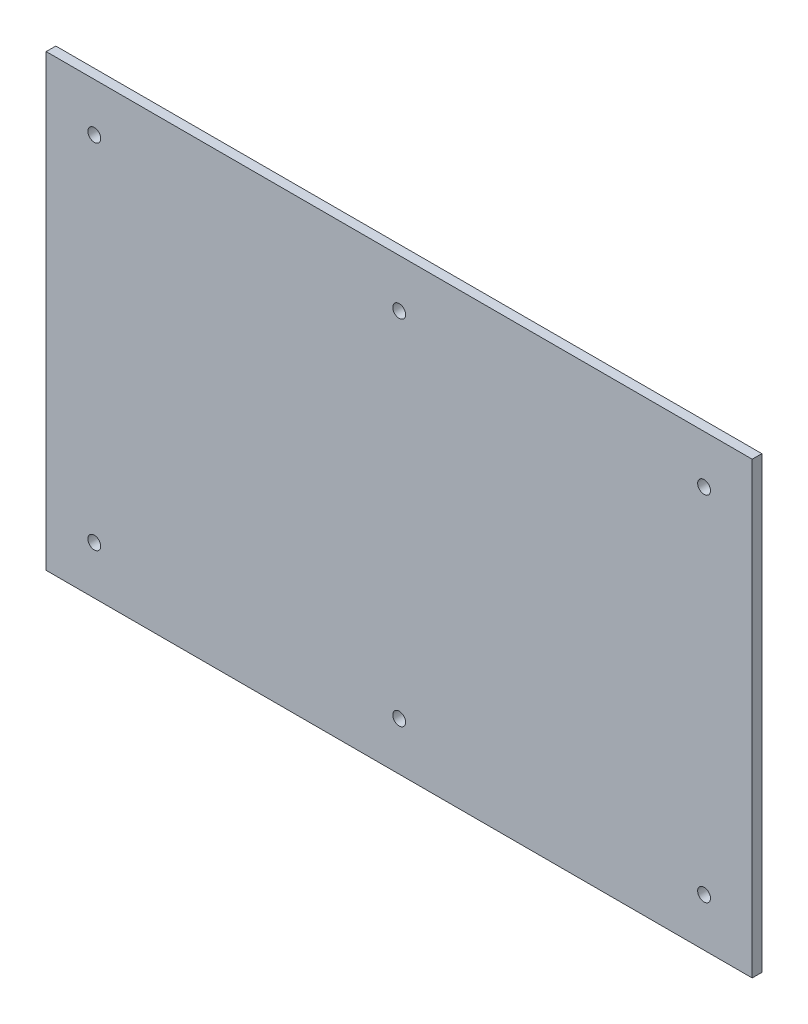
ISO-10303-21;
HEADER;
FILE_DESCRIPTION(('STEP AP214'),'2;1');
FILE_NAME('part.step','',(''),(''),'','','');
FILE_SCHEMA(('AUTOMOTIVE_DESIGN { 1 0 10303 214 1 1 1 1 }'));
ENDSEC;
DATA;
#1=APPLICATION_CONTEXT('core data for automotive mechanical design processes');
#2=APPLICATION_PROTOCOL_DEFINITION('international standard','automotive_design',2000,#1);
#3=PRODUCT_CONTEXT('',#1,'mechanical');
#4=PRODUCT('Part','Part','',(#3));
#5=PRODUCT_RELATED_PRODUCT_CATEGORY('part','',(#4));
#6=PRODUCT_DEFINITION_FORMATION('','',#4);
#7=PRODUCT_DEFINITION_CONTEXT('part definition',#1,'design');
#8=PRODUCT_DEFINITION('design','',#6,#7);
#9=PRODUCT_DEFINITION_SHAPE('','',#8);
#10=(LENGTH_UNIT() NAMED_UNIT(*) SI_UNIT(.MILLI.,.METRE.));
#11=(NAMED_UNIT(*) PLANE_ANGLE_UNIT() SI_UNIT($,.RADIAN.));
#12=(NAMED_UNIT(*) SI_UNIT($,.STERADIAN.) SOLID_ANGLE_UNIT());
#13=UNCERTAINTY_MEASURE_WITH_UNIT(LENGTH_MEASURE(1.E-05),#10,'distance_accuracy_value','');
#14=(GEOMETRIC_REPRESENTATION_CONTEXT(3) GLOBAL_UNCERTAINTY_ASSIGNED_CONTEXT((#13)) GLOBAL_UNIT_ASSIGNED_CONTEXT((#10,
#11,#12)) REPRESENTATION_CONTEXT('',''));
#15=CARTESIAN_POINT('',(0.,0.,0.));
#16=DIRECTION('',(0.,0.,1.));
#17=DIRECTION('',(1.,0.,0.));
#18=AXIS2_PLACEMENT_3D('',#15,#16,#17);
#19=CARTESIAN_POINT('',(0.,0.,3.));
#20=DIRECTION('',(1.,0.,0.));
#21=DIRECTION('',(0.,0.,-1.));
#22=AXIS2_PLACEMENT_3D('',#19,#20,#21);
#23=PLANE('',#22);
#24=DIRECTION('',(0.,-1.,0.));
#25=VECTOR('',#24,1.);
#26=CARTESIAN_POINT('',(0.,0.,0.));
#27=LINE('',#26,#25);
#28=CARTESIAN_POINT('',(0.,140.,0.));
#29=VERTEX_POINT('',#28);
#30=CARTESIAN_POINT('',(0.,0.,0.));
#31=VERTEX_POINT('',#30);
#32=EDGE_CURVE('E99',#29,#31,#27,.T.);
#33=ORIENTED_EDGE('',*,*,#32,.T.);
#34=DIRECTION('',(0.,0.,-1.));
#35=VECTOR('',#34,1.);
#36=CARTESIAN_POINT('',(0.,0.,3.));
#37=LINE('',#36,#35);
#38=CARTESIAN_POINT('',(0.,0.,3.));
#39=VERTEX_POINT('',#38);
#40=EDGE_CURVE('E11',#39,#31,#37,.T.);
#41=ORIENTED_EDGE('',*,*,#40,.F.);
#42=DIRECTION('',(0.,-1.,0.));
#43=VECTOR('',#42,1.);
#44=CARTESIAN_POINT('',(0.,0.,3.));
#45=LINE('',#44,#43);
#46=CARTESIAN_POINT('',(0.,140.,3.));
#47=VERTEX_POINT('',#46);
#48=EDGE_CURVE('E87',#47,#39,#45,.T.);
#49=ORIENTED_EDGE('',*,*,#48,.F.);
#50=DIRECTION('',(0.,0.,-1.));
#51=VECTOR('',#50,1.);
#52=CARTESIAN_POINT('',(0.,140.,3.));
#53=LINE('',#52,#51);
#54=EDGE_CURVE('E95',#47,#29,#53,.T.);
#55=ORIENTED_EDGE('',*,*,#54,.T.);
#56=EDGE_LOOP('',(#33,#41,#49,#55));
#57=FACE_BOUND('',#56,.T.);
#58=ADVANCED_FACE('F36',(#57),#23,.F.);
#59=CARTESIAN_POINT('',(0.,0.,3.));
#60=DIRECTION('',(0.,1.,0.));
#61=DIRECTION('',(0.,0.,1.));
#62=AXIS2_PLACEMENT_3D('',#59,#60,#61);
#63=PLANE('',#62);
#64=DIRECTION('',(1.,0.,0.));
#65=VECTOR('',#64,1.);
#66=CARTESIAN_POINT('',(0.,0.,0.));
#67=LINE('',#66,#65);
#68=CARTESIAN_POINT('',(220.,0.,0.));
#69=VERTEX_POINT('',#68);
#70=EDGE_CURVE('E91',#31,#69,#67,.T.);
#71=ORIENTED_EDGE('',*,*,#70,.T.);
#72=DIRECTION('',(0.,0.,-1.));
#73=VECTOR('',#72,1.);
#74=CARTESIAN_POINT('',(220.,0.,3.));
#75=LINE('',#74,#73);
#76=CARTESIAN_POINT('',(220.,0.,3.));
#77=VERTEX_POINT('',#76);
#78=EDGE_CURVE('E44',#77,#69,#75,.T.);
#79=ORIENTED_EDGE('',*,*,#78,.F.);
#80=DIRECTION('',(1.,0.,0.));
#81=VECTOR('',#80,1.);
#82=CARTESIAN_POINT('',(0.,0.,3.));
#83=LINE('',#82,#81);
#84=EDGE_CURVE('E82',#39,#77,#83,.T.);
#85=ORIENTED_EDGE('',*,*,#84,.F.);
#86=ORIENTED_EDGE('',*,*,#40,.T.);
#87=EDGE_LOOP('',(#71,#79,#85,#86));
#88=FACE_BOUND('',#87,.T.);
#89=ADVANCED_FACE('F90',(#88),#63,.F.);
#90=CARTESIAN_POINT('',(220.,0.,3.));
#91=DIRECTION('',(-1.,0.,0.));
#92=DIRECTION('',(0.,0.,1.));
#93=AXIS2_PLACEMENT_3D('',#90,#91,#92);
#94=PLANE('',#93);
#95=DIRECTION('',(0.,1.,0.));
#96=VECTOR('',#95,1.);
#97=CARTESIAN_POINT('',(220.,0.,0.));
#98=LINE('',#97,#96);
#99=CARTESIAN_POINT('',(220.,140.,0.));
#100=VERTEX_POINT('',#99);
#101=EDGE_CURVE('E69',#69,#100,#98,.T.);
#102=ORIENTED_EDGE('',*,*,#101,.T.);
#103=DIRECTION('',(0.,0.,-1.));
#104=VECTOR('',#103,1.);
#105=CARTESIAN_POINT('',(220.,140.,3.));
#106=LINE('',#105,#104);
#107=CARTESIAN_POINT('',(220.,140.,3.));
#108=VERTEX_POINT('',#107);
#109=EDGE_CURVE('E92',#108,#100,#106,.T.);
#110=ORIENTED_EDGE('',*,*,#109,.F.);
#111=DIRECTION('',(0.,1.,0.));
#112=VECTOR('',#111,1.);
#113=CARTESIAN_POINT('',(220.,0.,3.));
#114=LINE('',#113,#112);
#115=EDGE_CURVE('E85',#77,#108,#114,.T.);
#116=ORIENTED_EDGE('',*,*,#115,.F.);
#117=ORIENTED_EDGE('',*,*,#78,.T.);
#118=EDGE_LOOP('',(#102,#110,#116,#117));
#119=FACE_BOUND('',#118,.T.);
#120=ADVANCED_FACE('F93',(#119),#94,.F.);
#121=CARTESIAN_POINT('',(0.,140.,3.));
#122=DIRECTION('',(0.,-1.,0.));
#123=DIRECTION('',(0.,0.,-1.));
#124=AXIS2_PLACEMENT_3D('',#121,#122,#123);
#125=PLANE('',#124);
#126=DIRECTION('',(-1.,0.,0.));
#127=VECTOR('',#126,1.);
#128=CARTESIAN_POINT('',(0.,140.,0.));
#129=LINE('',#128,#127);
#130=EDGE_CURVE('E75',#100,#29,#129,.T.);
#131=ORIENTED_EDGE('',*,*,#130,.T.);
#132=ORIENTED_EDGE('',*,*,#54,.F.);
#133=DIRECTION('',(-1.,0.,0.));
#134=VECTOR('',#133,1.);
#135=CARTESIAN_POINT('',(0.,140.,3.));
#136=LINE('',#135,#134);
#137=EDGE_CURVE('E52',#108,#47,#136,.T.);
#138=ORIENTED_EDGE('',*,*,#137,.F.);
#139=ORIENTED_EDGE('',*,*,#109,.T.);
#140=EDGE_LOOP('',(#131,#132,#138,#139));
#141=FACE_BOUND('',#140,.T.);
#142=ADVANCED_FACE('F107',(#141),#125,.F.);
#143=CARTESIAN_POINT('',(0.,0.,3.));
#144=DIRECTION('',(0.,0.,-1.));
#145=DIRECTION('',(-1.,0.,0.));
#146=AXIS2_PLACEMENT_3D('',#143,#144,#145);
#147=PLANE('',#146);
#148=CARTESIAN_POINT('',(15.,15.,3.));
#149=DIRECTION('',(0.,0.,1.));
#150=DIRECTION('',(-1.,0.,0.));
#151=AXIS2_PLACEMENT_3D('',#148,#149,#150);
#152=CIRCLE('',#151,2.);
#153=CARTESIAN_POINT('',(13.,15.,3.));
#154=VERTEX_POINT('',#153);
#155=EDGE_CURVE('E119',#154,#154,#152,.T.);
#156=ORIENTED_EDGE('',*,*,#155,.F.);
#157=EDGE_LOOP('',(#156));
#158=FACE_BOUND('',#157,.T.);
#159=CARTESIAN_POINT('',(110.,15.,3.));
#160=DIRECTION('',(0.,0.,1.));
#161=DIRECTION('',(-1.,0.,0.));
#162=AXIS2_PLACEMENT_3D('',#159,#160,#161);
#163=CIRCLE('',#162,2.);
#164=CARTESIAN_POINT('',(108.,15.,3.));
#165=VERTEX_POINT('',#164);
#166=EDGE_CURVE('E125',#165,#165,#163,.T.);
#167=ORIENTED_EDGE('',*,*,#166,.F.);
#168=EDGE_LOOP('',(#167));
#169=FACE_BOUND('',#168,.T.);
#170=CARTESIAN_POINT('',(205.,15.,3.));
#171=DIRECTION('',(0.,0.,1.));
#172=DIRECTION('',(-1.,0.,0.));
#173=AXIS2_PLACEMENT_3D('',#170,#171,#172);
#174=CIRCLE('',#173,2.);
#175=CARTESIAN_POINT('',(203.,15.,3.));
#176=VERTEX_POINT('',#175);
#177=EDGE_CURVE('E131',#176,#176,#174,.T.);
#178=ORIENTED_EDGE('',*,*,#177,.F.);
#179=EDGE_LOOP('',(#178));
#180=FACE_BOUND('',#179,.T.);
#181=CARTESIAN_POINT('',(110.,125.,3.));
#182=DIRECTION('',(0.,0.,1.));
#183=DIRECTION('',(1.,0.,0.));
#184=AXIS2_PLACEMENT_3D('',#181,#182,#183);
#185=CIRCLE('',#184,2.);
#186=CARTESIAN_POINT('',(112.,125.,3.));
#187=VERTEX_POINT('',#186);
#188=EDGE_CURVE('E137',#187,#187,#185,.T.);
#189=ORIENTED_EDGE('',*,*,#188,.F.);
#190=EDGE_LOOP('',(#189));
#191=FACE_BOUND('',#190,.T.);
#192=CARTESIAN_POINT('',(205.,125.,3.));
#193=DIRECTION('',(0.,0.,1.));
#194=DIRECTION('',(1.,0.,0.));
#195=AXIS2_PLACEMENT_3D('',#192,#193,#194);
#196=CIRCLE('',#195,2.);
#197=CARTESIAN_POINT('',(207.,125.,3.));
#198=VERTEX_POINT('',#197);
#199=EDGE_CURVE('E143',#198,#198,#196,.T.);
#200=ORIENTED_EDGE('',*,*,#199,.F.);
#201=EDGE_LOOP('',(#200));
#202=FACE_BOUND('',#201,.T.);
#203=CARTESIAN_POINT('',(15.,125.,3.));
#204=DIRECTION('',(0.,0.,1.));
#205=DIRECTION('',(1.,0.,0.));
#206=AXIS2_PLACEMENT_3D('',#203,#204,#205);
#207=CIRCLE('',#206,2.);
#208=CARTESIAN_POINT('',(17.,125.,3.));
#209=VERTEX_POINT('',#208);
#210=EDGE_CURVE('E113',#209,#209,#207,.T.);
#211=ORIENTED_EDGE('',*,*,#210,.F.);
#212=EDGE_LOOP('',(#211));
#213=FACE_BOUND('',#212,.T.);
#214=ORIENTED_EDGE('',*,*,#48,.T.);
#215=ORIENTED_EDGE('',*,*,#84,.T.);
#216=ORIENTED_EDGE('',*,*,#115,.T.);
#217=ORIENTED_EDGE('',*,*,#137,.T.);
#218=EDGE_LOOP('',(#214,#215,#216,#217));
#219=FACE_BOUND('',#218,.T.);
#220=ADVANCED_FACE('F83',(#158,#169,#180,#191,#202,#213,#219),#147,.F.);
#221=CARTESIAN_POINT('',(0.,0.,0.));
#222=DIRECTION('',(0.,0.,-1.));
#223=DIRECTION('',(-1.,0.,0.));
#224=AXIS2_PLACEMENT_3D('',#221,#222,#223);
#225=PLANE('',#224);
#226=CARTESIAN_POINT('',(15.,15.,0.));
#227=DIRECTION('',(0.,0.,1.));
#228=DIRECTION('',(-1.,0.,0.));
#229=AXIS2_PLACEMENT_3D('',#226,#227,#228);
#230=CIRCLE('',#229,2.);
#231=CARTESIAN_POINT('',(13.,15.,0.));
#232=VERTEX_POINT('',#231);
#233=EDGE_CURVE('E122',#232,#232,#230,.T.);
#234=ORIENTED_EDGE('',*,*,#233,.T.);
#235=EDGE_LOOP('',(#234));
#236=FACE_BOUND('',#235,.T.);
#237=CARTESIAN_POINT('',(110.,15.,0.));
#238=DIRECTION('',(0.,0.,1.));
#239=DIRECTION('',(-1.,0.,0.));
#240=AXIS2_PLACEMENT_3D('',#237,#238,#239);
#241=CIRCLE('',#240,2.);
#242=CARTESIAN_POINT('',(108.,15.,0.));
#243=VERTEX_POINT('',#242);
#244=EDGE_CURVE('E128',#243,#243,#241,.T.);
#245=ORIENTED_EDGE('',*,*,#244,.T.);
#246=EDGE_LOOP('',(#245));
#247=FACE_BOUND('',#246,.T.);
#248=CARTESIAN_POINT('',(205.,15.,0.));
#249=DIRECTION('',(0.,0.,1.));
#250=DIRECTION('',(-1.,0.,0.));
#251=AXIS2_PLACEMENT_3D('',#248,#249,#250);
#252=CIRCLE('',#251,2.);
#253=CARTESIAN_POINT('',(203.,15.,0.));
#254=VERTEX_POINT('',#253);
#255=EDGE_CURVE('E134',#254,#254,#252,.T.);
#256=ORIENTED_EDGE('',*,*,#255,.T.);
#257=EDGE_LOOP('',(#256));
#258=FACE_BOUND('',#257,.T.);
#259=CARTESIAN_POINT('',(110.,125.,0.));
#260=DIRECTION('',(0.,0.,1.));
#261=DIRECTION('',(1.,0.,0.));
#262=AXIS2_PLACEMENT_3D('',#259,#260,#261);
#263=CIRCLE('',#262,2.);
#264=CARTESIAN_POINT('',(112.,125.,0.));
#265=VERTEX_POINT('',#264);
#266=EDGE_CURVE('E140',#265,#265,#263,.T.);
#267=ORIENTED_EDGE('',*,*,#266,.T.);
#268=EDGE_LOOP('',(#267));
#269=FACE_BOUND('',#268,.T.);
#270=CARTESIAN_POINT('',(205.,125.,0.));
#271=DIRECTION('',(0.,0.,1.));
#272=DIRECTION('',(1.,0.,0.));
#273=AXIS2_PLACEMENT_3D('',#270,#271,#272);
#274=CIRCLE('',#273,2.);
#275=CARTESIAN_POINT('',(207.,125.,0.));
#276=VERTEX_POINT('',#275);
#277=EDGE_CURVE('E116',#276,#276,#274,.T.);
#278=ORIENTED_EDGE('',*,*,#277,.T.);
#279=EDGE_LOOP('',(#278));
#280=FACE_BOUND('',#279,.T.);
#281=CARTESIAN_POINT('',(15.,125.,0.));
#282=DIRECTION('',(0.,0.,1.));
#283=DIRECTION('',(1.,0.,0.));
#284=AXIS2_PLACEMENT_3D('',#281,#282,#283);
#285=CIRCLE('',#284,2.);
#286=CARTESIAN_POINT('',(17.,125.,0.));
#287=VERTEX_POINT('',#286);
#288=EDGE_CURVE('E102',#287,#287,#285,.T.);
#289=ORIENTED_EDGE('',*,*,#288,.T.);
#290=EDGE_LOOP('',(#289));
#291=FACE_BOUND('',#290,.T.);
#292=ORIENTED_EDGE('',*,*,#32,.F.);
#293=ORIENTED_EDGE('',*,*,#130,.F.);
#294=ORIENTED_EDGE('',*,*,#101,.F.);
#295=ORIENTED_EDGE('',*,*,#70,.F.);
#296=EDGE_LOOP('',(#292,#293,#294,#295));
#297=FACE_BOUND('',#296,.T.);
#298=ADVANCED_FACE('F110',(#236,#247,#258,#269,#280,#291,#297),#225,.T.);
#299=CARTESIAN_POINT('',(15.,125.,0.));
#300=DIRECTION('',(0.,0.,1.));
#301=DIRECTION('',(1.,0.,0.));
#302=AXIS2_PLACEMENT_3D('',#299,#300,#301);
#303=CYLINDRICAL_SURFACE('',#302,2.);
#304=ORIENTED_EDGE('',*,*,#288,.F.);
#305=EDGE_LOOP('',(#304));
#306=FACE_BOUND('',#305,.T.);
#307=ORIENTED_EDGE('',*,*,#210,.T.);
#308=EDGE_LOOP('',(#307));
#309=FACE_BOUND('',#308,.T.);
#310=ADVANCED_FACE('F155',(#306,#309),#303,.F.);
#311=CARTESIAN_POINT('',(205.,125.,0.));
#312=DIRECTION('',(0.,0.,1.));
#313=DIRECTION('',(1.,0.,0.));
#314=AXIS2_PLACEMENT_3D('',#311,#312,#313);
#315=CYLINDRICAL_SURFACE('',#314,2.);
#316=ORIENTED_EDGE('',*,*,#277,.F.);
#317=EDGE_LOOP('',(#316));
#318=FACE_BOUND('',#317,.T.);
#319=ORIENTED_EDGE('',*,*,#199,.T.);
#320=EDGE_LOOP('',(#319));
#321=FACE_BOUND('',#320,.T.);
#322=ADVANCED_FACE('F151',(#318,#321),#315,.F.);
#323=CARTESIAN_POINT('',(110.,125.,0.));
#324=DIRECTION('',(0.,0.,1.));
#325=DIRECTION('',(1.,0.,0.));
#326=AXIS2_PLACEMENT_3D('',#323,#324,#325);
#327=CYLINDRICAL_SURFACE('',#326,2.);
#328=ORIENTED_EDGE('',*,*,#266,.F.);
#329=EDGE_LOOP('',(#328));
#330=FACE_BOUND('',#329,.T.);
#331=ORIENTED_EDGE('',*,*,#188,.T.);
#332=EDGE_LOOP('',(#331));
#333=FACE_BOUND('',#332,.T.);
#334=ADVANCED_FACE('F154',(#330,#333),#327,.F.);
#335=CARTESIAN_POINT('',(205.,15.,0.));
#336=DIRECTION('',(0.,0.,1.));
#337=DIRECTION('',(1.,0.,0.));
#338=AXIS2_PLACEMENT_3D('',#335,#336,#337);
#339=CYLINDRICAL_SURFACE('',#338,2.);
#340=ORIENTED_EDGE('',*,*,#255,.F.);
#341=EDGE_LOOP('',(#340));
#342=FACE_BOUND('',#341,.T.);
#343=ORIENTED_EDGE('',*,*,#177,.T.);
#344=EDGE_LOOP('',(#343));
#345=FACE_BOUND('',#344,.T.);
#346=ADVANCED_FACE('F216',(#342,#345),#339,.F.);
#347=CARTESIAN_POINT('',(110.,15.,0.));
#348=DIRECTION('',(0.,0.,1.));
#349=DIRECTION('',(1.,0.,0.));
#350=AXIS2_PLACEMENT_3D('',#347,#348,#349);
#351=CYLINDRICAL_SURFACE('',#350,2.);
#352=ORIENTED_EDGE('',*,*,#244,.F.);
#353=EDGE_LOOP('',(#352));
#354=FACE_BOUND('',#353,.T.);
#355=ORIENTED_EDGE('',*,*,#166,.T.);
#356=EDGE_LOOP('',(#355));
#357=FACE_BOUND('',#356,.T.);
#358=ADVANCED_FACE('F226',(#354,#357),#351,.F.);
#359=CARTESIAN_POINT('',(15.,15.,0.));
#360=DIRECTION('',(0.,0.,1.));
#361=DIRECTION('',(1.,0.,0.));
#362=AXIS2_PLACEMENT_3D('',#359,#360,#361);
#363=CYLINDRICAL_SURFACE('',#362,2.);
#364=ORIENTED_EDGE('',*,*,#233,.F.);
#365=EDGE_LOOP('',(#364));
#366=FACE_BOUND('',#365,.T.);
#367=ORIENTED_EDGE('',*,*,#155,.T.);
#368=EDGE_LOOP('',(#367));
#369=FACE_BOUND('',#368,.T.);
#370=ADVANCED_FACE('F236',(#366,#369),#363,.F.);
#371=CLOSED_SHELL('',(#58,#89,#120,#142,#220,#298,#310,#322,#334,#346,#358,#370));
#372=MANIFOLD_SOLID_BREP('B2',#371);
#373=ADVANCED_BREP_SHAPE_REPRESENTATION('',(#18,#372),#14);
#374=SHAPE_DEFINITION_REPRESENTATION(#9,#373);
ENDSEC;
END-ISO-10303-21;
